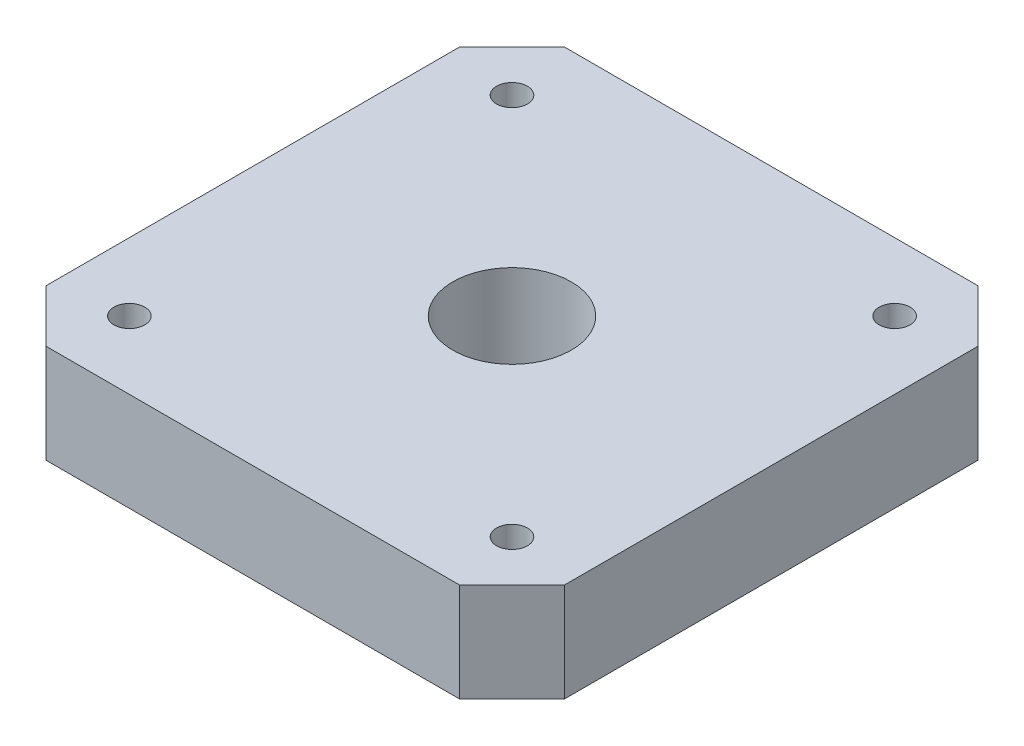
ISO-10303-21;
HEADER;
FILE_DESCRIPTION(('STEP AP214'),'2;1');
FILE_NAME('part.step','',(''),(''),'','','');
FILE_SCHEMA(('AUTOMOTIVE_DESIGN { 1 0 10303 214 1 1 1 1 }'));
ENDSEC;
DATA;
#1=APPLICATION_CONTEXT('core data for automotive mechanical design processes');
#2=APPLICATION_PROTOCOL_DEFINITION('international standard','automotive_design',2000,#1);
#3=PRODUCT_CONTEXT('',#1,'mechanical');
#4=PRODUCT('Part','Part','',(#3));
#5=PRODUCT_RELATED_PRODUCT_CATEGORY('part','',(#4));
#6=PRODUCT_DEFINITION_FORMATION('','',#4);
#7=PRODUCT_DEFINITION_CONTEXT('part definition',#1,'design');
#8=PRODUCT_DEFINITION('design','',#6,#7);
#9=PRODUCT_DEFINITION_SHAPE('','',#8);
#10=(LENGTH_UNIT() NAMED_UNIT(*) SI_UNIT(.MILLI.,.METRE.));
#11=(NAMED_UNIT(*) PLANE_ANGLE_UNIT() SI_UNIT($,.RADIAN.));
#12=(NAMED_UNIT(*) SI_UNIT($,.STERADIAN.) SOLID_ANGLE_UNIT());
#13=UNCERTAINTY_MEASURE_WITH_UNIT(LENGTH_MEASURE(1.E-05),#10,'distance_accuracy_value','');
#14=(GEOMETRIC_REPRESENTATION_CONTEXT(3) GLOBAL_UNCERTAINTY_ASSIGNED_CONTEXT((#13)) GLOBAL_UNIT_ASSIGNED_CONTEXT((#10,
#11,#12)) REPRESENTATION_CONTEXT('',''));
#15=CARTESIAN_POINT('',(0.,0.,0.));
#16=DIRECTION('',(0.,0.,1.));
#17=DIRECTION('',(1.,0.,0.));
#18=AXIS2_PLACEMENT_3D('',#15,#16,#17);
#19=CARTESIAN_POINT('',(16.7573593128807,-8.,21.));
#20=DIRECTION('',(-0.707106781186548,0.,-0.707106781186548));
#21=DIRECTION('',(0.,1.,0.));
#22=AXIS2_PLACEMENT_3D('',#19,#20,#21);
#23=PLANE('',#22);
#24=DIRECTION('',(0.,1.,0.));
#25=VECTOR('',#24,1.);
#26=CARTESIAN_POINT('',(16.7573593128807,-8.,21.));
#27=LINE('',#26,#25);
#28=CARTESIAN_POINT('',(16.7573593128807,-8.,21.));
#29=VERTEX_POINT('',#28);
#30=CARTESIAN_POINT('',(16.7573593128807,0.,21.));
#31=VERTEX_POINT('',#30);
#32=EDGE_CURVE('E173',#29,#31,#27,.T.);
#33=ORIENTED_EDGE('',*,*,#32,.F.);
#34=DIRECTION('',(0.707106781186548,0.,-0.707106781186548));
#35=VECTOR('',#34,1.);
#36=CARTESIAN_POINT('',(18.8786796564404,-8.,18.8786796564404));
#37=LINE('',#36,#35);
#38=CARTESIAN_POINT('',(21.,-8.,16.7573593128807));
#39=VERTEX_POINT('',#38);
#40=EDGE_CURVE('E80',#39,#29,#37,.F.);
#41=ORIENTED_EDGE('',*,*,#40,.F.);
#42=DIRECTION('',(0.,-1.,0.));
#43=VECTOR('',#42,1.);
#44=CARTESIAN_POINT('',(21.,-8.,16.7573593128807));
#45=LINE('',#44,#43);
#46=CARTESIAN_POINT('',(21.,0.,16.7573593128807));
#47=VERTEX_POINT('',#46);
#48=EDGE_CURVE('E177',#47,#39,#45,.T.);
#49=ORIENTED_EDGE('',*,*,#48,.F.);
#50=DIRECTION('',(-0.707106781186548,0.,0.707106781186548));
#51=VECTOR('',#50,1.);
#52=CARTESIAN_POINT('',(16.7573593128807,0.,21.));
#53=LINE('',#52,#51);
#54=EDGE_CURVE('E56',#31,#47,#53,.F.);
#55=ORIENTED_EDGE('',*,*,#54,.F.);
#56=EDGE_LOOP('',(#33,#41,#49,#55));
#57=FACE_BOUND('',#56,.T.);
#58=ADVANCED_FACE('F54',(#57),#23,.F.);
#59=CARTESIAN_POINT('',(16.7573593128807,-8.,-21.));
#60=DIRECTION('',(-0.707106781186548,0.,0.707106781186548));
#61=DIRECTION('',(0.,-1.,0.));
#62=AXIS2_PLACEMENT_3D('',#59,#60,#61);
#63=PLANE('',#62);
#64=DIRECTION('',(0.,-1.,0.));
#65=VECTOR('',#64,1.);
#66=CARTESIAN_POINT('',(16.7573593128807,-8.,-21.));
#67=LINE('',#66,#65);
#68=CARTESIAN_POINT('',(16.7573593128807,0.,-21.));
#69=VERTEX_POINT('',#68);
#70=CARTESIAN_POINT('',(16.7573593128807,-8.,-21.));
#71=VERTEX_POINT('',#70);
#72=EDGE_CURVE('E165',#69,#71,#67,.T.);
#73=ORIENTED_EDGE('',*,*,#72,.F.);
#74=DIRECTION('',(0.707106781186548,0.,0.707106781186548));
#75=VECTOR('',#74,1.);
#76=CARTESIAN_POINT('',(16.7573593128807,0.,-21.));
#77=LINE('',#76,#75);
#78=CARTESIAN_POINT('',(21.,0.,-16.7573593128807));
#79=VERTEX_POINT('',#78);
#80=EDGE_CURVE('E169',#79,#69,#77,.F.);
#81=ORIENTED_EDGE('',*,*,#80,.F.);
#82=DIRECTION('',(0.,1.,0.));
#83=VECTOR('',#82,1.);
#84=CARTESIAN_POINT('',(21.,-8.,-16.7573593128807));
#85=LINE('',#84,#83);
#86=CARTESIAN_POINT('',(21.,-8.,-16.7573593128807));
#87=VERTEX_POINT('',#86);
#88=EDGE_CURVE('E164',#87,#79,#85,.T.);
#89=ORIENTED_EDGE('',*,*,#88,.F.);
#90=DIRECTION('',(-0.707106781186548,0.,-0.707106781186548));
#91=VECTOR('',#90,1.);
#92=CARTESIAN_POINT('',(18.8786796564404,-8.,-18.8786796564404));
#93=LINE('',#92,#91);
#94=EDGE_CURVE('E168',#71,#87,#93,.F.);
#95=ORIENTED_EDGE('',*,*,#94,.F.);
#96=EDGE_LOOP('',(#73,#81,#89,#95));
#97=FACE_BOUND('',#96,.T.);
#98=ADVANCED_FACE('F210',(#97),#63,.F.);
#99=CARTESIAN_POINT('',(-21.,-8.,-16.7573593128807));
#100=DIRECTION('',(0.707106781186548,0.,0.707106781186548));
#101=DIRECTION('',(0.,-1.,0.));
#102=AXIS2_PLACEMENT_3D('',#99,#100,#101);
#103=PLANE('',#102);
#104=DIRECTION('',(0.,-1.,0.));
#105=VECTOR('',#104,1.);
#106=CARTESIAN_POINT('',(-21.,-8.,-16.7573593128807));
#107=LINE('',#106,#105);
#108=CARTESIAN_POINT('',(-21.,0.,-16.7573593128807));
#109=VERTEX_POINT('',#108);
#110=CARTESIAN_POINT('',(-21.,-8.,-16.7573593128807));
#111=VERTEX_POINT('',#110);
#112=EDGE_CURVE('E136',#109,#111,#107,.T.);
#113=ORIENTED_EDGE('',*,*,#112,.F.);
#114=DIRECTION('',(0.707106781186548,0.,-0.707106781186548));
#115=VECTOR('',#114,1.);
#116=CARTESIAN_POINT('',(-21.,0.,-16.7573593128807));
#117=LINE('',#116,#115);
#118=CARTESIAN_POINT('',(-16.7573593128807,0.,-21.));
#119=VERTEX_POINT('',#118);
#120=EDGE_CURVE('E124',#119,#109,#117,.F.);
#121=ORIENTED_EDGE('',*,*,#120,.F.);
#122=DIRECTION('',(0.,1.,0.));
#123=VECTOR('',#122,1.);
#124=CARTESIAN_POINT('',(-16.7573593128807,-8.,-21.));
#125=LINE('',#124,#123);
#126=CARTESIAN_POINT('',(-16.7573593128807,-8.,-21.));
#127=VERTEX_POINT('',#126);
#128=EDGE_CURVE('E154',#127,#119,#125,.T.);
#129=ORIENTED_EDGE('',*,*,#128,.F.);
#130=DIRECTION('',(-0.707106781186548,0.,0.707106781186548));
#131=VECTOR('',#130,1.);
#132=CARTESIAN_POINT('',(-18.8786796564404,-8.,-18.8786796564404));
#133=LINE('',#132,#131);
#134=EDGE_CURVE('E157',#111,#127,#133,.F.);
#135=ORIENTED_EDGE('',*,*,#134,.F.);
#136=EDGE_LOOP('',(#113,#121,#129,#135));
#137=FACE_BOUND('',#136,.T.);
#138=ADVANCED_FACE('F205',(#137),#103,.F.);
#139=CARTESIAN_POINT('',(-21.,-8.,16.7573593128807));
#140=DIRECTION('',(0.707106781186547,0.,-0.707106781186547));
#141=DIRECTION('',(0.,1.,0.));
#142=AXIS2_PLACEMENT_3D('',#139,#140,#141);
#143=PLANE('',#142);
#144=DIRECTION('',(0.,1.,0.));
#145=VECTOR('',#144,1.);
#146=CARTESIAN_POINT('',(-21.,-8.,16.7573593128807));
#147=LINE('',#146,#145);
#148=CARTESIAN_POINT('',(-21.,-8.,16.7573593128807));
#149=VERTEX_POINT('',#148);
#150=CARTESIAN_POINT('',(-21.,0.,16.7573593128807));
#151=VERTEX_POINT('',#150);
#152=EDGE_CURVE('E131',#149,#151,#147,.T.);
#153=ORIENTED_EDGE('',*,*,#152,.F.);
#154=DIRECTION('',(0.707106781186548,0.,0.707106781186548));
#155=VECTOR('',#154,1.);
#156=CARTESIAN_POINT('',(-18.8786796564404,-8.,18.8786796564404));
#157=LINE('',#156,#155);
#158=CARTESIAN_POINT('',(-16.7573593128807,-8.,21.));
#159=VERTEX_POINT('',#158);
#160=EDGE_CURVE('E138',#159,#149,#157,.F.);
#161=ORIENTED_EDGE('',*,*,#160,.F.);
#162=DIRECTION('',(0.,-1.,0.));
#163=VECTOR('',#162,1.);
#164=CARTESIAN_POINT('',(-16.7573593128807,-8.,21.));
#165=LINE('',#164,#163);
#166=CARTESIAN_POINT('',(-16.7573593128807,0.,21.));
#167=VERTEX_POINT('',#166);
#168=EDGE_CURVE('E139',#167,#159,#165,.T.);
#169=ORIENTED_EDGE('',*,*,#168,.F.);
#170=DIRECTION('',(-0.707106781186548,0.,-0.707106781186548));
#171=VECTOR('',#170,1.);
#172=CARTESIAN_POINT('',(-21.,0.,16.7573593128807));
#173=LINE('',#172,#171);
#174=EDGE_CURVE('E122',#151,#167,#173,.F.);
#175=ORIENTED_EDGE('',*,*,#174,.F.);
#176=EDGE_LOOP('',(#153,#161,#169,#175));
#177=FACE_BOUND('',#176,.T.);
#178=ADVANCED_FACE('F134',(#177),#143,.F.);
#179=CARTESIAN_POINT('',(21.,-8.,21.));
#180=DIRECTION('',(1.,0.,0.));
#181=DIRECTION('',(0.,0.,-1.));
#182=AXIS2_PLACEMENT_3D('',#179,#180,#181);
#183=PLANE('',#182);
#184=DIRECTION('',(0.,0.,-1.));
#185=VECTOR('',#184,1.);
#186=CARTESIAN_POINT('',(21.,0.,21.));
#187=LINE('',#186,#185);
#188=EDGE_CURVE('E195',#47,#79,#187,.T.);
#189=ORIENTED_EDGE('',*,*,#188,.F.);
#190=ORIENTED_EDGE('',*,*,#48,.T.);
#191=DIRECTION('',(0.,0.,-1.));
#192=VECTOR('',#191,1.);
#193=CARTESIAN_POINT('',(21.,-8.,21.));
#194=LINE('',#193,#192);
#195=EDGE_CURVE('E182',#39,#87,#194,.T.);
#196=ORIENTED_EDGE('',*,*,#195,.T.);
#197=ORIENTED_EDGE('',*,*,#88,.T.);
#198=EDGE_LOOP('',(#189,#190,#196,#197));
#199=FACE_BOUND('',#198,.T.);
#200=ADVANCED_FACE('F207',(#199),#183,.T.);
#201=CARTESIAN_POINT('',(-21.,-8.,21.));
#202=DIRECTION('',(0.,0.,1.));
#203=DIRECTION('',(1.,0.,0.));
#204=AXIS2_PLACEMENT_3D('',#201,#202,#203);
#205=PLANE('',#204);
#206=DIRECTION('',(1.,0.,0.));
#207=VECTOR('',#206,1.);
#208=CARTESIAN_POINT('',(-21.,-8.,21.));
#209=LINE('',#208,#207);
#210=EDGE_CURVE('E148',#159,#29,#209,.T.);
#211=ORIENTED_EDGE('',*,*,#210,.T.);
#212=ORIENTED_EDGE('',*,*,#32,.T.);
#213=DIRECTION('',(1.,0.,0.));
#214=VECTOR('',#213,1.);
#215=CARTESIAN_POINT('',(-21.,0.,21.));
#216=LINE('',#215,#214);
#217=EDGE_CURVE('E129',#167,#31,#216,.T.);
#218=ORIENTED_EDGE('',*,*,#217,.F.);
#219=ORIENTED_EDGE('',*,*,#168,.T.);
#220=EDGE_LOOP('',(#211,#212,#218,#219));
#221=FACE_BOUND('',#220,.T.);
#222=ADVANCED_FACE('F181',(#221),#205,.T.);
#223=CARTESIAN_POINT('',(-21.,-8.,21.));
#224=DIRECTION('',(-1.,0.,0.));
#225=DIRECTION('',(0.,0.,1.));
#226=AXIS2_PLACEMENT_3D('',#223,#224,#225);
#227=PLANE('',#226);
#228=DIRECTION('',(0.,0.,1.));
#229=VECTOR('',#228,1.);
#230=CARTESIAN_POINT('',(-21.,0.,21.));
#231=LINE('',#230,#229);
#232=EDGE_CURVE('E118',#109,#151,#231,.T.);
#233=ORIENTED_EDGE('',*,*,#232,.F.);
#234=ORIENTED_EDGE('',*,*,#112,.T.);
#235=DIRECTION('',(0.,0.,1.));
#236=VECTOR('',#235,1.);
#237=CARTESIAN_POINT('',(-21.,-8.,21.));
#238=LINE('',#237,#236);
#239=EDGE_CURVE('E145',#111,#149,#238,.T.);
#240=ORIENTED_EDGE('',*,*,#239,.T.);
#241=ORIENTED_EDGE('',*,*,#152,.T.);
#242=EDGE_LOOP('',(#233,#234,#240,#241));
#243=FACE_BOUND('',#242,.T.);
#244=ADVANCED_FACE('F142',(#243),#227,.T.);
#245=CARTESIAN_POINT('',(-21.,-8.,-21.));
#246=DIRECTION('',(0.,0.,-1.));
#247=DIRECTION('',(-1.,0.,0.));
#248=AXIS2_PLACEMENT_3D('',#245,#246,#247);
#249=PLANE('',#248);
#250=DIRECTION('',(-1.,0.,0.));
#251=VECTOR('',#250,1.);
#252=CARTESIAN_POINT('',(-21.,0.,-21.));
#253=LINE('',#252,#251);
#254=EDGE_CURVE('E128',#69,#119,#253,.T.);
#255=ORIENTED_EDGE('',*,*,#254,.F.);
#256=ORIENTED_EDGE('',*,*,#72,.T.);
#257=DIRECTION('',(-1.,0.,0.));
#258=VECTOR('',#257,1.);
#259=CARTESIAN_POINT('',(-21.,-8.,-21.));
#260=LINE('',#259,#258);
#261=EDGE_CURVE('E184',#71,#127,#260,.T.);
#262=ORIENTED_EDGE('',*,*,#261,.T.);
#263=ORIENTED_EDGE('',*,*,#128,.T.);
#264=EDGE_LOOP('',(#255,#256,#262,#263));
#265=FACE_BOUND('',#264,.T.);
#266=ADVANCED_FACE('F201',(#265),#249,.T.);
#267=CARTESIAN_POINT('',(0.,-8.,0.));
#268=DIRECTION('',(0.,-1.,0.));
#269=DIRECTION('',(0.,0.,-1.));
#270=AXIS2_PLACEMENT_3D('',#267,#268,#269);
#271=PLANE('',#270);
#272=CARTESIAN_POINT('',(0.,-8.,0.));
#273=DIRECTION('',(0.,-1.,0.));
#274=DIRECTION('',(0.,0.,-1.));
#275=AXIS2_PLACEMENT_3D('',#272,#273,#274);
#276=CIRCLE('',#275,11.);
#277=CARTESIAN_POINT('',(0.,-8.,-11.));
#278=VERTEX_POINT('',#277);
#279=EDGE_CURVE('E13',#278,#278,#276,.T.);
#280=ORIENTED_EDGE('',*,*,#279,.F.);
#281=EDGE_LOOP('',(#280));
#282=FACE_BOUND('',#281,.T.);
#283=CARTESIAN_POINT('',(15.5,-8.,-15.5));
#284=DIRECTION('',(0.,1.,0.));
#285=DIRECTION('',(0.,0.,1.));
#286=AXIS2_PLACEMENT_3D('',#283,#284,#285);
#287=CIRCLE('',#286,1.25);
#288=CARTESIAN_POINT('',(15.5,-8.,-14.25));
#289=VERTEX_POINT('',#288);
#290=EDGE_CURVE('E400',#289,#289,#287,.T.);
#291=ORIENTED_EDGE('',*,*,#290,.T.);
#292=EDGE_LOOP('',(#291));
#293=FACE_BOUND('',#292,.T.);
#294=CARTESIAN_POINT('',(-15.5,-8.,15.5));
#295=DIRECTION('',(0.,1.,0.));
#296=DIRECTION('',(0.,0.,1.));
#297=AXIS2_PLACEMENT_3D('',#294,#295,#296);
#298=CIRCLE('',#297,1.25);
#299=CARTESIAN_POINT('',(-15.5,-8.,16.75));
#300=VERTEX_POINT('',#299);
#301=EDGE_CURVE('E392',#300,#300,#298,.T.);
#302=ORIENTED_EDGE('',*,*,#301,.T.);
#303=EDGE_LOOP('',(#302));
#304=FACE_BOUND('',#303,.T.);
#305=CARTESIAN_POINT('',(15.5,-8.,15.5));
#306=DIRECTION('',(0.,1.,0.));
#307=DIRECTION('',(0.,0.,1.));
#308=AXIS2_PLACEMENT_3D('',#305,#306,#307);
#309=CIRCLE('',#308,1.25);
#310=CARTESIAN_POINT('',(15.5,-8.,16.75));
#311=VERTEX_POINT('',#310);
#312=EDGE_CURVE('E387',#311,#311,#309,.T.);
#313=ORIENTED_EDGE('',*,*,#312,.T.);
#314=EDGE_LOOP('',(#313));
#315=FACE_BOUND('',#314,.T.);
#316=CARTESIAN_POINT('',(-15.5,-8.,-15.5));
#317=DIRECTION('',(0.,1.,0.));
#318=DIRECTION('',(0.,0.,1.));
#319=AXIS2_PLACEMENT_3D('',#316,#317,#318);
#320=CIRCLE('',#319,1.25);
#321=CARTESIAN_POINT('',(-15.5,-8.,-14.25));
#322=VERTEX_POINT('',#321);
#323=EDGE_CURVE('E193',#322,#322,#320,.T.);
#324=ORIENTED_EDGE('',*,*,#323,.T.);
#325=EDGE_LOOP('',(#324));
#326=FACE_BOUND('',#325,.T.);
#327=ORIENTED_EDGE('',*,*,#195,.F.);
#328=ORIENTED_EDGE('',*,*,#40,.T.);
#329=ORIENTED_EDGE('',*,*,#210,.F.);
#330=ORIENTED_EDGE('',*,*,#160,.T.);
#331=ORIENTED_EDGE('',*,*,#239,.F.);
#332=ORIENTED_EDGE('',*,*,#134,.T.);
#333=ORIENTED_EDGE('',*,*,#261,.F.);
#334=ORIENTED_EDGE('',*,*,#94,.T.);
#335=EDGE_LOOP('',(#327,#328,#329,#330,#331,#332,#333,#334));
#336=FACE_BOUND('',#335,.T.);
#337=ADVANCED_FACE('F176',(#282,#293,#304,#315,#326,#336),#271,.T.);
#338=CARTESIAN_POINT('',(0.,0.,0.));
#339=DIRECTION('',(0.,-1.,0.));
#340=DIRECTION('',(0.,0.,-1.));
#341=AXIS2_PLACEMENT_3D('',#338,#339,#340);
#342=PLANE('',#341);
#343=CARTESIAN_POINT('',(0.,0.,0.));
#344=DIRECTION('',(0.,-1.,0.));
#345=DIRECTION('',(0.,0.,-1.));
#346=AXIS2_PLACEMENT_3D('',#343,#344,#345);
#347=CIRCLE('',#346,4.8);
#348=CARTESIAN_POINT('',(0.,0.,-4.8));
#349=VERTEX_POINT('',#348);
#350=EDGE_CURVE('E380',#349,#349,#347,.T.);
#351=ORIENTED_EDGE('',*,*,#350,.T.);
#352=EDGE_LOOP('',(#351));
#353=FACE_BOUND('',#352,.T.);
#354=CARTESIAN_POINT('',(15.5,0.,-15.5));
#355=DIRECTION('',(0.,1.,0.));
#356=DIRECTION('',(0.,0.,1.));
#357=AXIS2_PLACEMENT_3D('',#354,#355,#356);
#358=CIRCLE('',#357,1.25);
#359=CARTESIAN_POINT('',(15.5,0.,-14.25));
#360=VERTEX_POINT('',#359);
#361=EDGE_CURVE('E394',#360,#360,#358,.T.);
#362=ORIENTED_EDGE('',*,*,#361,.F.);
#363=EDGE_LOOP('',(#362));
#364=FACE_BOUND('',#363,.T.);
#365=CARTESIAN_POINT('',(-15.5,0.,15.5));
#366=DIRECTION('',(0.,1.,0.));
#367=DIRECTION('',(0.,0.,1.));
#368=AXIS2_PLACEMENT_3D('',#365,#366,#367);
#369=CIRCLE('',#368,1.25);
#370=CARTESIAN_POINT('',(-15.5,0.,16.75));
#371=VERTEX_POINT('',#370);
#372=EDGE_CURVE('E396',#371,#371,#369,.T.);
#373=ORIENTED_EDGE('',*,*,#372,.F.);
#374=EDGE_LOOP('',(#373));
#375=FACE_BOUND('',#374,.T.);
#376=CARTESIAN_POINT('',(15.5,0.,15.5));
#377=DIRECTION('',(0.,1.,0.));
#378=DIRECTION('',(0.,0.,1.));
#379=AXIS2_PLACEMENT_3D('',#376,#377,#378);
#380=CIRCLE('',#379,1.25);
#381=CARTESIAN_POINT('',(15.5,0.,16.75));
#382=VERTEX_POINT('',#381);
#383=EDGE_CURVE('E389',#382,#382,#380,.T.);
#384=ORIENTED_EDGE('',*,*,#383,.F.);
#385=EDGE_LOOP('',(#384));
#386=FACE_BOUND('',#385,.T.);
#387=CARTESIAN_POINT('',(-15.5,0.,-15.5));
#388=DIRECTION('',(0.,1.,0.));
#389=DIRECTION('',(0.,0.,1.));
#390=AXIS2_PLACEMENT_3D('',#387,#388,#389);
#391=CIRCLE('',#390,1.25);
#392=CARTESIAN_POINT('',(-15.5,0.,-14.25));
#393=VERTEX_POINT('',#392);
#394=EDGE_CURVE('E189',#393,#393,#391,.T.);
#395=ORIENTED_EDGE('',*,*,#394,.F.);
#396=EDGE_LOOP('',(#395));
#397=FACE_BOUND('',#396,.T.);
#398=ORIENTED_EDGE('',*,*,#217,.T.);
#399=ORIENTED_EDGE('',*,*,#54,.T.);
#400=ORIENTED_EDGE('',*,*,#188,.T.);
#401=ORIENTED_EDGE('',*,*,#80,.T.);
#402=ORIENTED_EDGE('',*,*,#254,.T.);
#403=ORIENTED_EDGE('',*,*,#120,.T.);
#404=ORIENTED_EDGE('',*,*,#232,.T.);
#405=ORIENTED_EDGE('',*,*,#174,.T.);
#406=EDGE_LOOP('',(#398,#399,#400,#401,#402,#403,#404,#405));
#407=FACE_BOUND('',#406,.T.);
#408=ADVANCED_FACE('F116',(#353,#364,#375,#386,#397,#407),#342,.F.);
#409=CARTESIAN_POINT('',(-15.5,-8.,-15.5));
#410=DIRECTION('',(0.,1.,0.));
#411=DIRECTION('',(0.,0.,1.));
#412=AXIS2_PLACEMENT_3D('',#409,#410,#411);
#413=CYLINDRICAL_SURFACE('',#412,1.25);
#414=ORIENTED_EDGE('',*,*,#323,.F.);
#415=EDGE_LOOP('',(#414));
#416=FACE_BOUND('',#415,.T.);
#417=ORIENTED_EDGE('',*,*,#394,.T.);
#418=EDGE_LOOP('',(#417));
#419=FACE_BOUND('',#418,.T.);
#420=ADVANCED_FACE('F283',(#416,#419),#413,.F.);
#421=CARTESIAN_POINT('',(15.5,-8.,15.5));
#422=DIRECTION('',(0.,1.,0.));
#423=DIRECTION('',(0.,0.,1.));
#424=AXIS2_PLACEMENT_3D('',#421,#422,#423);
#425=CYLINDRICAL_SURFACE('',#424,1.25);
#426=ORIENTED_EDGE('',*,*,#312,.F.);
#427=EDGE_LOOP('',(#426));
#428=FACE_BOUND('',#427,.T.);
#429=ORIENTED_EDGE('',*,*,#383,.T.);
#430=EDGE_LOOP('',(#429));
#431=FACE_BOUND('',#430,.T.);
#432=ADVANCED_FACE('F310',(#428,#431),#425,.F.);
#433=CARTESIAN_POINT('',(-15.5,-8.,15.5));
#434=DIRECTION('',(0.,1.,0.));
#435=DIRECTION('',(0.,0.,1.));
#436=AXIS2_PLACEMENT_3D('',#433,#434,#435);
#437=CYLINDRICAL_SURFACE('',#436,1.25);
#438=ORIENTED_EDGE('',*,*,#301,.F.);
#439=EDGE_LOOP('',(#438));
#440=FACE_BOUND('',#439,.T.);
#441=ORIENTED_EDGE('',*,*,#372,.T.);
#442=EDGE_LOOP('',(#441));
#443=FACE_BOUND('',#442,.T.);
#444=ADVANCED_FACE('F319',(#440,#443),#437,.F.);
#445=CARTESIAN_POINT('',(15.5,-8.,-15.5));
#446=DIRECTION('',(0.,1.,0.));
#447=DIRECTION('',(0.,0.,1.));
#448=AXIS2_PLACEMENT_3D('',#445,#446,#447);
#449=CYLINDRICAL_SURFACE('',#448,1.25);
#450=ORIENTED_EDGE('',*,*,#290,.F.);
#451=EDGE_LOOP('',(#450));
#452=FACE_BOUND('',#451,.T.);
#453=ORIENTED_EDGE('',*,*,#361,.T.);
#454=EDGE_LOOP('',(#453));
#455=FACE_BOUND('',#454,.T.);
#456=ADVANCED_FACE('F332',(#452,#455),#449,.F.);
#457=CARTESIAN_POINT('',(0.,-10.,0.));
#458=DIRECTION('',(0.,1.,0.));
#459=DIRECTION('',(0.,0.,1.));
#460=AXIS2_PLACEMENT_3D('',#457,#458,#459);
#461=CYLINDRICAL_SURFACE('',#460,11.);
#462=CARTESIAN_POINT('',(0.,-10.,0.));
#463=DIRECTION('',(0.,-1.,0.));
#464=DIRECTION('',(0.,0.,-1.));
#465=AXIS2_PLACEMENT_3D('',#462,#463,#464);
#466=CIRCLE('',#465,11.);
#467=CARTESIAN_POINT('',(0.,-10.,-11.));
#468=VERTEX_POINT('',#467);
#469=EDGE_CURVE('E385',#468,#468,#466,.T.);
#470=ORIENTED_EDGE('',*,*,#469,.F.);
#471=EDGE_LOOP('',(#470));
#472=FACE_BOUND('',#471,.T.);
#473=ORIENTED_EDGE('',*,*,#279,.T.);
#474=EDGE_LOOP('',(#473));
#475=FACE_BOUND('',#474,.T.);
#476=ADVANCED_FACE('F342',(#472,#475),#461,.T.);
#477=CARTESIAN_POINT('',(0.,-10.,0.));
#478=DIRECTION('',(0.,-1.,0.));
#479=DIRECTION('',(0.,0.,-1.));
#480=AXIS2_PLACEMENT_3D('',#477,#478,#479);
#481=PLANE('',#480);
#482=CARTESIAN_POINT('',(0.,-10.,0.));
#483=DIRECTION('',(0.,-1.,0.));
#484=DIRECTION('',(0.,0.,-1.));
#485=AXIS2_PLACEMENT_3D('',#482,#483,#484);
#486=CIRCLE('',#485,4.8);
#487=CARTESIAN_POINT('',(0.,-10.,-4.8));
#488=VERTEX_POINT('',#487);
#489=EDGE_CURVE('E379',#488,#488,#486,.T.);
#490=ORIENTED_EDGE('',*,*,#489,.F.);
#491=EDGE_LOOP('',(#490));
#492=FACE_BOUND('',#491,.T.);
#493=ORIENTED_EDGE('',*,*,#469,.T.);
#494=EDGE_LOOP('',(#493));
#495=FACE_BOUND('',#494,.T.);
#496=ADVANCED_FACE('F352',(#492,#495),#481,.T.);
#497=CARTESIAN_POINT('',(0.,0.,0.));
#498=DIRECTION('',(0.,-1.,0.));
#499=DIRECTION('',(0.,0.,-1.));
#500=AXIS2_PLACEMENT_3D('',#497,#498,#499);
#501=CYLINDRICAL_SURFACE('',#500,4.8);
#502=ORIENTED_EDGE('',*,*,#350,.F.);
#503=EDGE_LOOP('',(#502));
#504=FACE_BOUND('',#503,.T.);
#505=ORIENTED_EDGE('',*,*,#489,.T.);
#506=EDGE_LOOP('',(#505));
#507=FACE_BOUND('',#506,.T.);
#508=ADVANCED_FACE('F356',(#504,#507),#501,.F.);
#509=CLOSED_SHELL('',(#58,#98,#138,#178,#200,#222,#244,#266,#337,#408,#420,#432,#444,#456,#476,
#496,#508));
#510=MANIFOLD_SOLID_BREP('B2',#509);
#511=ADVANCED_BREP_SHAPE_REPRESENTATION('',(#18,#510),#14);
#512=SHAPE_DEFINITION_REPRESENTATION(#9,#511);
ENDSEC;
END-ISO-10303-21;
